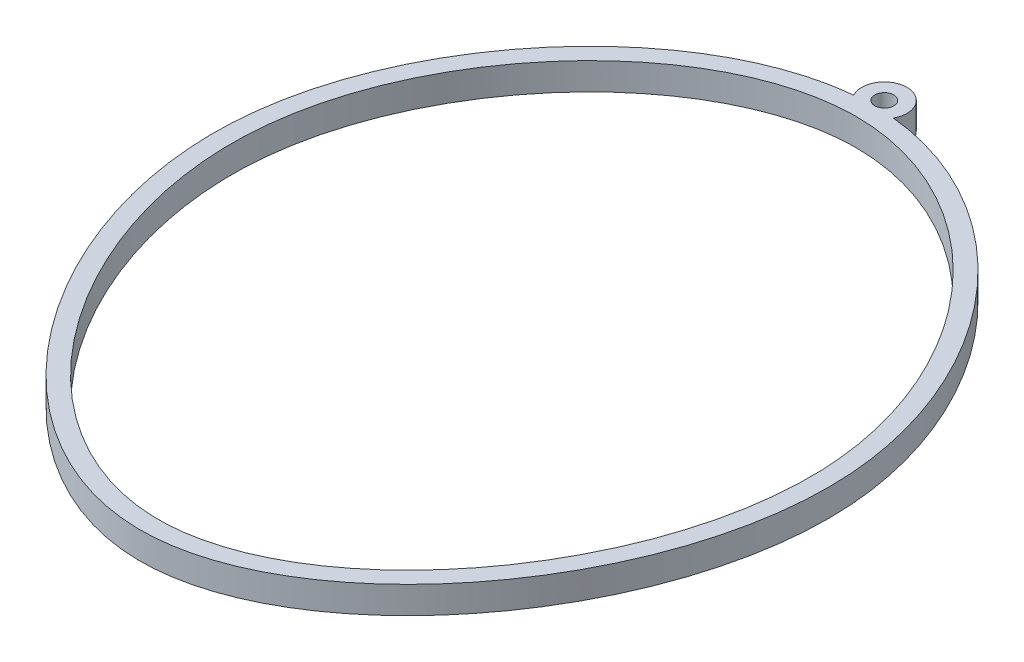
ISO-10303-21;
HEADER;
FILE_DESCRIPTION(('STEP AP214'),'2;1');
FILE_NAME('part.step','',(''),(''),'','','');
FILE_SCHEMA(('AUTOMOTIVE_DESIGN { 1 0 10303 214 1 1 1 1 }'));
ENDSEC;
DATA;
#1=APPLICATION_CONTEXT('core data for automotive mechanical design processes');
#2=APPLICATION_PROTOCOL_DEFINITION('international standard','automotive_design',2000,#1);
#3=PRODUCT_CONTEXT('',#1,'mechanical');
#4=PRODUCT('Part','Part','',(#3));
#5=PRODUCT_RELATED_PRODUCT_CATEGORY('part','',(#4));
#6=PRODUCT_DEFINITION_FORMATION('','',#4);
#7=PRODUCT_DEFINITION_CONTEXT('part definition',#1,'design');
#8=PRODUCT_DEFINITION('design','',#6,#7);
#9=PRODUCT_DEFINITION_SHAPE('','',#8);
#10=(LENGTH_UNIT() NAMED_UNIT(*) SI_UNIT(.MILLI.,.METRE.));
#11=(NAMED_UNIT(*) PLANE_ANGLE_UNIT() SI_UNIT($,.RADIAN.));
#12=(NAMED_UNIT(*) SI_UNIT($,.STERADIAN.) SOLID_ANGLE_UNIT());
#13=UNCERTAINTY_MEASURE_WITH_UNIT(LENGTH_MEASURE(1.E-05),#10,'distance_accuracy_value','');
#14=(GEOMETRIC_REPRESENTATION_CONTEXT(3) GLOBAL_UNCERTAINTY_ASSIGNED_CONTEXT((#13)) GLOBAL_UNIT_ASSIGNED_CONTEXT((#10,
#11,#12)) REPRESENTATION_CONTEXT('',''));
#15=CARTESIAN_POINT('',(0.,0.,0.));
#16=DIRECTION('',(0.,0.,1.));
#17=DIRECTION('',(1.,0.,0.));
#18=AXIS2_PLACEMENT_3D('',#15,#16,#17);
#19=CARTESIAN_POINT('',(0.,3.,-37.84405));
#20=DIRECTION('',(0.,-1.,0.));
#21=DIRECTION('',(0.,0.,-1.));
#22=AXIS2_PLACEMENT_3D('',#19,#20,#21);
#23=CYLINDRICAL_SURFACE('',#22,2.5);
#24=CARTESIAN_POINT('',(0.,0.,-37.84405));
#25=DIRECTION('',(0.,1.,0.));
#26=DIRECTION('',(0.,0.,1.));
#27=AXIS2_PLACEMENT_3D('',#24,#25,#26);
#28=CIRCLE('',#27,2.5);
#29=CARTESIAN_POINT('',(2.19080013460545,0.,-36.6397266338675));
#30=VERTEX_POINT('',#29);
#31=CARTESIAN_POINT('',(-2.19080013460545,0.,-36.6397266338675));
#32=VERTEX_POINT('',#31);
#33=EDGE_CURVE('E62',#30,#32,#28,.T.);
#34=ORIENTED_EDGE('',*,*,#33,.T.);
#35=DIRECTION('',(0.,-1.,0.));
#36=VECTOR('',#35,1.);
#37=CARTESIAN_POINT('',(-2.19080013460545,3.,-36.6397266338675));
#38=LINE('',#37,#36);
#39=CARTESIAN_POINT('',(-2.19080013460545,3.,-36.6397266338675));
#40=VERTEX_POINT('',#39);
#41=EDGE_CURVE('E11',#40,#32,#38,.T.);
#42=ORIENTED_EDGE('',*,*,#41,.F.);
#43=CARTESIAN_POINT('',(0.,3.,-37.84405));
#44=DIRECTION('',(0.,1.,0.));
#45=DIRECTION('',(0.,0.,1.));
#46=AXIS2_PLACEMENT_3D('',#43,#44,#45);
#47=CIRCLE('',#46,2.5);
#48=CARTESIAN_POINT('',(2.19080013460545,3.,-36.6397266338675));
#49=VERTEX_POINT('',#48);
#50=EDGE_CURVE('E64',#49,#40,#47,.T.);
#51=ORIENTED_EDGE('',*,*,#50,.F.);
#52=DIRECTION('',(0.,-1.,0.));
#53=VECTOR('',#52,1.);
#54=CARTESIAN_POINT('',(2.19080013460545,3.,-36.6397266338675));
#55=LINE('',#54,#53);
#56=EDGE_CURVE('E46',#49,#30,#55,.T.);
#57=ORIENTED_EDGE('',*,*,#56,.T.);
#58=EDGE_LOOP('',(#34,#42,#51,#57));
#59=FACE_BOUND('',#58,.T.);
#60=ADVANCED_FACE('F37',(#59),#23,.T.);
#61=CARTESIAN_POINT('',(0.,3.,-36.74405));
#62=CARTESIAN_POINT('',(16.3542377433442,3.,-36.74405));
#63=CARTESIAN_POINT('',(50.9991774637337,3.,0.668721052035075));
#64=CARTESIAN_POINT('',(0.,3.,67.5870503087566));
#65=CARTESIAN_POINT('',(-50.9991774637337,3.,0.668721052035075));
#66=CARTESIAN_POINT('',(-16.3542377433442,3.,-36.74405));
#67=CARTESIAN_POINT('',(0.,3.,-36.74405));
#68=B_SPLINE_CURVE_WITH_KNOTS('',3,(#61,#62,#63,#64,#65,#66,#67),.UNSPECIFIED.,.T.,.F.,(4,1,1,1,
4),(0.,0.236026355873831,0.5,0.763973644126169,1.),.UNSPECIFIED.);
#69=DIRECTION('',(0.,-1.,0.));
#70=VECTOR('',#69,1.);
#71=SURFACE_OF_LINEAR_EXTRUSION('',#68,#70);
#72=CARTESIAN_POINT('',(0.,0.,-36.74405));
#73=CARTESIAN_POINT('',(16.3542377433442,0.,-36.74405));
#74=CARTESIAN_POINT('',(50.9991774637337,0.,0.668721052035075));
#75=CARTESIAN_POINT('',(0.,0.,67.5870503087566));
#76=CARTESIAN_POINT('',(-50.9991774637337,0.,0.668721052035075));
#77=CARTESIAN_POINT('',(-16.3542377433442,0.,-36.74405));
#78=CARTESIAN_POINT('',(0.,0.,-36.74405));
#79=B_SPLINE_CURVE_WITH_KNOTS('',3,(#72,#73,#74,#75,#76,#77,#78),.UNSPECIFIED.,.T.,.F.,(4,1,1,1,
4),(0.,0.236026355873831,0.5,0.763973644126169,1.),.UNSPECIFIED.);
#80=EDGE_CURVE('E70',#30,#32,#79,.T.);
#81=ORIENTED_EDGE('',*,*,#80,.F.);
#82=ORIENTED_EDGE('',*,*,#56,.F.);
#83=EDGE_CURVE('E97',#49,#40,#68,.T.);
#84=ORIENTED_EDGE('',*,*,#83,.T.);
#85=ORIENTED_EDGE('',*,*,#41,.T.);
#86=EDGE_LOOP('',(#81,#82,#84,#85));
#87=FACE_BOUND('',#86,.T.);
#88=ADVANCED_FACE('F73',(#87),#71,.T.);
#89=CARTESIAN_POINT('',(0.,3.,-37.84405));
#90=DIRECTION('',(0.,-1.,0.));
#91=DIRECTION('',(0.,0.,-1.));
#92=AXIS2_PLACEMENT_3D('',#89,#90,#91);
#93=CYLINDRICAL_SURFACE('',#92,1.05);
#94=CARTESIAN_POINT('',(0.,3.,-37.84405));
#95=DIRECTION('',(0.,1.,0.));
#96=DIRECTION('',(0.,0.,1.));
#97=AXIS2_PLACEMENT_3D('',#94,#95,#96);
#98=CIRCLE('',#97,1.05);
#99=CARTESIAN_POINT('',(0.,3.,-36.79405));
#100=VERTEX_POINT('',#99);
#101=EDGE_CURVE('E77',#100,#100,#98,.T.);
#102=ORIENTED_EDGE('',*,*,#101,.T.);
#103=EDGE_LOOP('',(#102));
#104=FACE_BOUND('',#103,.T.);
#105=CARTESIAN_POINT('',(0.,0.,-37.84405));
#106=DIRECTION('',(0.,1.,0.));
#107=DIRECTION('',(0.,0.,1.));
#108=AXIS2_PLACEMENT_3D('',#105,#106,#107);
#109=CIRCLE('',#108,1.05);
#110=CARTESIAN_POINT('',(0.,0.,-36.79405));
#111=VERTEX_POINT('',#110);
#112=EDGE_CURVE('E71',#111,#111,#109,.T.);
#113=ORIENTED_EDGE('',*,*,#112,.F.);
#114=EDGE_LOOP('',(#113));
#115=FACE_BOUND('',#114,.T.);
#116=ADVANCED_FACE('F39',(#104,#115),#93,.F.);
#117=CARTESIAN_POINT('',(0.,3.,-34.74405));
#118=CARTESIAN_POINT('',(15.3574036630198,3.,-34.74405));
#119=CARTESIAN_POINT('',(48.0074827950162,3.,0.704881259661088));
#120=CARTESIAN_POINT('',(0.,3.,64.5826089915566));
#121=CARTESIAN_POINT('',(-48.0074827950162,3.,0.704881259661105));
#122=CARTESIAN_POINT('',(-15.3574036630198,3.,-34.74405));
#123=CARTESIAN_POINT('',(0.,3.,-34.74405));
#124=B_SPLINE_CURVE_WITH_KNOTS('',3,(#117,#118,#119,#120,#121,#122,#123),.UNSPECIFIED.,.T.,.F.,
(4,1,1,1,4),(0.,0.235181721932947,0.5,0.764818278067053,1.),.UNSPECIFIED.);
#125=DIRECTION('',(0.,-1.,0.));
#126=VECTOR('',#125,1.);
#127=SURFACE_OF_LINEAR_EXTRUSION('',#124,#126);
#128=CARTESIAN_POINT('',(0.,3.,-34.74405));
#129=VERTEX_POINT('',#128);
#130=EDGE_CURVE('E66',#129,#129,#124,.T.);
#131=ORIENTED_EDGE('',*,*,#130,.F.);
#132=EDGE_LOOP('',(#131));
#133=FACE_BOUND('',#132,.T.);
#134=CARTESIAN_POINT('',(0.,0.,-34.74405));
#135=CARTESIAN_POINT('',(15.3574036630198,0.,-34.74405));
#136=CARTESIAN_POINT('',(48.0074827950162,0.,0.704881259661088));
#137=CARTESIAN_POINT('',(0.,0.,64.5826089915566));
#138=CARTESIAN_POINT('',(-48.0074827950162,0.,0.704881259661105));
#139=CARTESIAN_POINT('',(-15.3574036630198,0.,-34.74405));
#140=CARTESIAN_POINT('',(0.,0.,-34.74405));
#141=B_SPLINE_CURVE_WITH_KNOTS('',3,(#134,#135,#136,#137,#138,#139,#140),.UNSPECIFIED.,.T.,.F.,
(4,1,1,1,4),(0.,0.235181721932947,0.5,0.764818278067053,1.),.UNSPECIFIED.);
#142=CARTESIAN_POINT('',(0.,0.,-34.74405));
#143=VERTEX_POINT('',#142);
#144=EDGE_CURVE('E74',#143,#143,#141,.T.);
#145=ORIENTED_EDGE('',*,*,#144,.T.);
#146=EDGE_LOOP('',(#145));
#147=FACE_BOUND('',#146,.T.);
#148=ADVANCED_FACE('F106',(#133,#147),#127,.F.);
#149=CARTESIAN_POINT('',(0.,3.,0.));
#150=DIRECTION('',(0.,1.,0.));
#151=DIRECTION('',(0.,0.,1.));
#152=AXIS2_PLACEMENT_3D('',#149,#150,#151);
#153=PLANE('',#152);
#154=ORIENTED_EDGE('',*,*,#101,.F.);
#155=EDGE_LOOP('',(#154));
#156=FACE_BOUND('',#155,.T.);
#157=ORIENTED_EDGE('',*,*,#50,.T.);
#158=ORIENTED_EDGE('',*,*,#83,.F.);
#159=EDGE_LOOP('',(#157,#158));
#160=FACE_BOUND('',#159,.T.);
#161=ORIENTED_EDGE('',*,*,#130,.T.);
#162=EDGE_LOOP('',(#161));
#163=FACE_BOUND('',#162,.T.);
#164=ADVANCED_FACE('F110',(#156,#160,#163),#153,.T.);
#165=CARTESIAN_POINT('',(0.,0.,0.));
#166=DIRECTION('',(0.,1.,0.));
#167=DIRECTION('',(0.,0.,1.));
#168=AXIS2_PLACEMENT_3D('',#165,#166,#167);
#169=PLANE('',#168);
#170=ORIENTED_EDGE('',*,*,#112,.T.);
#171=EDGE_LOOP('',(#170));
#172=FACE_BOUND('',#171,.T.);
#173=ORIENTED_EDGE('',*,*,#33,.F.);
#174=ORIENTED_EDGE('',*,*,#80,.T.);
#175=EDGE_LOOP('',(#173,#174));
#176=FACE_BOUND('',#175,.T.);
#177=ORIENTED_EDGE('',*,*,#144,.F.);
#178=EDGE_LOOP('',(#177));
#179=FACE_BOUND('',#178,.T.);
#180=ADVANCED_FACE('F68',(#172,#176,#179),#169,.F.);
#181=CLOSED_SHELL('',(#60,#88,#116,#148,#164,#180));
#182=MANIFOLD_SOLID_BREP('B2',#181);
#183=ADVANCED_BREP_SHAPE_REPRESENTATION('',(#18,#182),#14);
#184=SHAPE_DEFINITION_REPRESENTATION(#9,#183);
ENDSEC;
END-ISO-10303-21;
